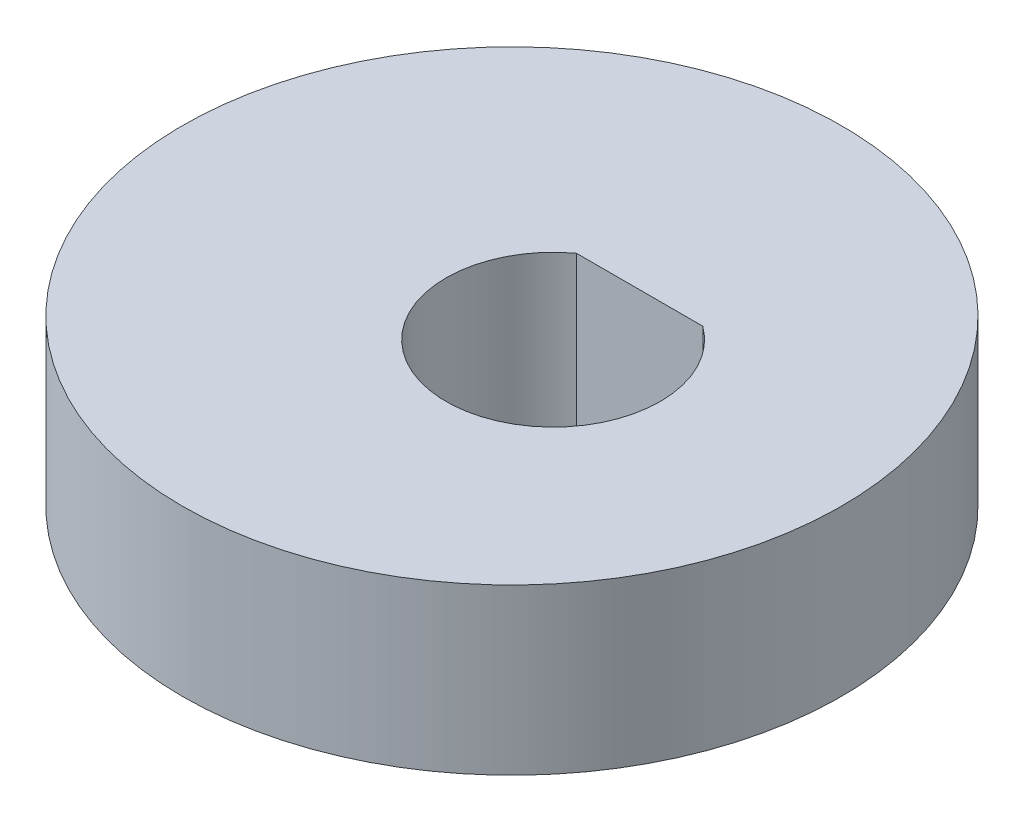
ISO-10303-21;
HEADER;
FILE_DESCRIPTION(('STEP AP214'),'2;1');
FILE_NAME('part.step','',(''),(''),'','','');
FILE_SCHEMA(('AUTOMOTIVE_DESIGN { 1 0 10303 214 1 1 1 1 }'));
ENDSEC;
DATA;
#1=APPLICATION_CONTEXT('core data for automotive mechanical design processes');
#2=APPLICATION_PROTOCOL_DEFINITION('international standard','automotive_design',2000,#1);
#3=PRODUCT_CONTEXT('',#1,'mechanical');
#4=PRODUCT('Part','Part','',(#3));
#5=PRODUCT_RELATED_PRODUCT_CATEGORY('part','',(#4));
#6=PRODUCT_DEFINITION_FORMATION('','',#4);
#7=PRODUCT_DEFINITION_CONTEXT('part definition',#1,'design');
#8=PRODUCT_DEFINITION('design','',#6,#7);
#9=PRODUCT_DEFINITION_SHAPE('','',#8);
#10=(LENGTH_UNIT() NAMED_UNIT(*) SI_UNIT(.MILLI.,.METRE.));
#11=(NAMED_UNIT(*) PLANE_ANGLE_UNIT() SI_UNIT($,.RADIAN.));
#12=(NAMED_UNIT(*) SI_UNIT($,.STERADIAN.) SOLID_ANGLE_UNIT());
#13=UNCERTAINTY_MEASURE_WITH_UNIT(LENGTH_MEASURE(1.E-05),#10,'distance_accuracy_value','');
#14=(GEOMETRIC_REPRESENTATION_CONTEXT(3) GLOBAL_UNCERTAINTY_ASSIGNED_CONTEXT((#13)) GLOBAL_UNIT_ASSIGNED_CONTEXT((#10,
#11,#12)) REPRESENTATION_CONTEXT('',''));
#15=CARTESIAN_POINT('',(0.,0.,0.));
#16=DIRECTION('',(0.,0.,1.));
#17=DIRECTION('',(1.,0.,0.));
#18=AXIS2_PLACEMENT_3D('',#15,#16,#17);
#19=CARTESIAN_POINT('',(1.,4.,0.));
#20=DIRECTION('',(0.,-1.,0.));
#21=DIRECTION('',(0.,0.,-1.));
#22=AXIS2_PLACEMENT_3D('',#19,#20,#21);
#23=CYLINDRICAL_SURFACE('',#22,2.6);
#24=CARTESIAN_POINT('',(1.,0.,0.));
#25=DIRECTION('',(0.,1.,0.));
#26=DIRECTION('',(0.,0.,1.));
#27=AXIS2_PLACEMENT_3D('',#24,#25,#26);
#28=CIRCLE('',#27,2.6);
#29=CARTESIAN_POINT('',(-0.532970971675588,0.,-2.1));
#30=VERTEX_POINT('',#29);
#31=CARTESIAN_POINT('',(2.53297097167559,0.,-2.1));
#32=VERTEX_POINT('',#31);
#33=EDGE_CURVE('E78',#30,#32,#28,.T.);
#34=ORIENTED_EDGE('',*,*,#33,.F.);
#35=DIRECTION('',(0.,-1.,0.));
#36=VECTOR('',#35,1.);
#37=CARTESIAN_POINT('',(-0.532970971675588,4.,-2.1));
#38=LINE('',#37,#36);
#39=CARTESIAN_POINT('',(-0.532970971675588,4.,-2.1));
#40=VERTEX_POINT('',#39);
#41=EDGE_CURVE('E11',#40,#30,#38,.T.);
#42=ORIENTED_EDGE('',*,*,#41,.F.);
#43=CARTESIAN_POINT('',(1.,4.,0.));
#44=DIRECTION('',(0.,1.,0.));
#45=DIRECTION('',(0.,0.,1.));
#46=AXIS2_PLACEMENT_3D('',#43,#44,#45);
#47=CIRCLE('',#46,2.6);
#48=CARTESIAN_POINT('',(2.53297097167559,4.,-2.1));
#49=VERTEX_POINT('',#48);
#50=EDGE_CURVE('E79',#40,#49,#47,.T.);
#51=ORIENTED_EDGE('',*,*,#50,.T.);
#52=DIRECTION('',(0.,-1.,0.));
#53=VECTOR('',#52,1.);
#54=CARTESIAN_POINT('',(2.53297097167559,4.,-2.1));
#55=LINE('',#54,#53);
#56=EDGE_CURVE('E58',#49,#32,#55,.T.);
#57=ORIENTED_EDGE('',*,*,#56,.T.);
#58=EDGE_LOOP('',(#34,#42,#51,#57));
#59=FACE_BOUND('',#58,.T.);
#60=ADVANCED_FACE('F49',(#59),#23,.F.);
#61=CARTESIAN_POINT('',(0.,4.,-2.1));
#62=DIRECTION('',(0.,0.,-1.));
#63=DIRECTION('',(-1.,0.,0.));
#64=AXIS2_PLACEMENT_3D('',#61,#62,#63);
#65=PLANE('',#64);
#66=DIRECTION('',(1.,0.,0.));
#67=VECTOR('',#66,1.);
#68=CARTESIAN_POINT('',(0.,0.,-2.1));
#69=LINE('',#68,#67);
#70=EDGE_CURVE('E82',#30,#32,#69,.T.);
#71=ORIENTED_EDGE('',*,*,#70,.T.);
#72=ORIENTED_EDGE('',*,*,#56,.F.);
#73=DIRECTION('',(1.,0.,0.));
#74=VECTOR('',#73,1.);
#75=CARTESIAN_POINT('',(0.,4.,-2.1));
#76=LINE('',#75,#74);
#77=EDGE_CURVE('E65',#40,#49,#76,.T.);
#78=ORIENTED_EDGE('',*,*,#77,.F.);
#79=ORIENTED_EDGE('',*,*,#41,.T.);
#80=EDGE_LOOP('',(#71,#72,#78,#79));
#81=FACE_BOUND('',#80,.T.);
#82=ADVANCED_FACE('F83',(#81),#65,.F.);
#83=CARTESIAN_POINT('',(0.,4.,0.));
#84=DIRECTION('',(0.,-1.,0.));
#85=DIRECTION('',(0.,0.,-1.));
#86=AXIS2_PLACEMENT_3D('',#83,#84,#85);
#87=CYLINDRICAL_SURFACE('',#86,8.);
#88=CARTESIAN_POINT('',(0.,4.,0.));
#89=DIRECTION('',(0.,1.,0.));
#90=DIRECTION('',(0.,0.,1.));
#91=AXIS2_PLACEMENT_3D('',#88,#89,#90);
#92=CIRCLE('',#91,8.);
#93=CARTESIAN_POINT('',(0.,4.,8.));
#94=VERTEX_POINT('',#93);
#95=EDGE_CURVE('E81',#94,#94,#92,.T.);
#96=ORIENTED_EDGE('',*,*,#95,.F.);
#97=EDGE_LOOP('',(#96));
#98=FACE_BOUND('',#97,.T.);
#99=CARTESIAN_POINT('',(0.,0.,0.));
#100=DIRECTION('',(0.,1.,0.));
#101=DIRECTION('',(0.,0.,1.));
#102=AXIS2_PLACEMENT_3D('',#99,#100,#101);
#103=CIRCLE('',#102,8.);
#104=CARTESIAN_POINT('',(0.,0.,8.));
#105=VERTEX_POINT('',#104);
#106=EDGE_CURVE('E86',#105,#105,#103,.T.);
#107=ORIENTED_EDGE('',*,*,#106,.T.);
#108=EDGE_LOOP('',(#107));
#109=FACE_BOUND('',#108,.T.);
#110=ADVANCED_FACE('F108',(#98,#109),#87,.T.);
#111=CARTESIAN_POINT('',(0.,4.,0.));
#112=DIRECTION('',(0.,1.,0.));
#113=DIRECTION('',(0.,0.,1.));
#114=AXIS2_PLACEMENT_3D('',#111,#112,#113);
#115=PLANE('',#114);
#116=ORIENTED_EDGE('',*,*,#50,.F.);
#117=ORIENTED_EDGE('',*,*,#77,.T.);
#118=EDGE_LOOP('',(#116,#117));
#119=FACE_BOUND('',#118,.T.);
#120=ORIENTED_EDGE('',*,*,#95,.T.);
#121=EDGE_LOOP('',(#120));
#122=FACE_BOUND('',#121,.T.);
#123=ADVANCED_FACE('F106',(#119,#122),#115,.T.);
#124=CARTESIAN_POINT('',(0.,0.,0.));
#125=DIRECTION('',(0.,1.,0.));
#126=DIRECTION('',(0.,0.,1.));
#127=AXIS2_PLACEMENT_3D('',#124,#125,#126);
#128=PLANE('',#127);
#129=ORIENTED_EDGE('',*,*,#33,.T.);
#130=ORIENTED_EDGE('',*,*,#70,.F.);
#131=EDGE_LOOP('',(#129,#130));
#132=FACE_BOUND('',#131,.T.);
#133=ORIENTED_EDGE('',*,*,#106,.F.);
#134=EDGE_LOOP('',(#133));
#135=FACE_BOUND('',#134,.T.);
#136=ADVANCED_FACE('F88',(#132,#135),#128,.F.);
#137=CLOSED_SHELL('',(#60,#82,#110,#123,#136));
#138=MANIFOLD_SOLID_BREP('B2',#137);
#139=ADVANCED_BREP_SHAPE_REPRESENTATION('',(#18,#138),#14);
#140=SHAPE_DEFINITION_REPRESENTATION(#9,#139);
ENDSEC;
END-ISO-10303-21;
